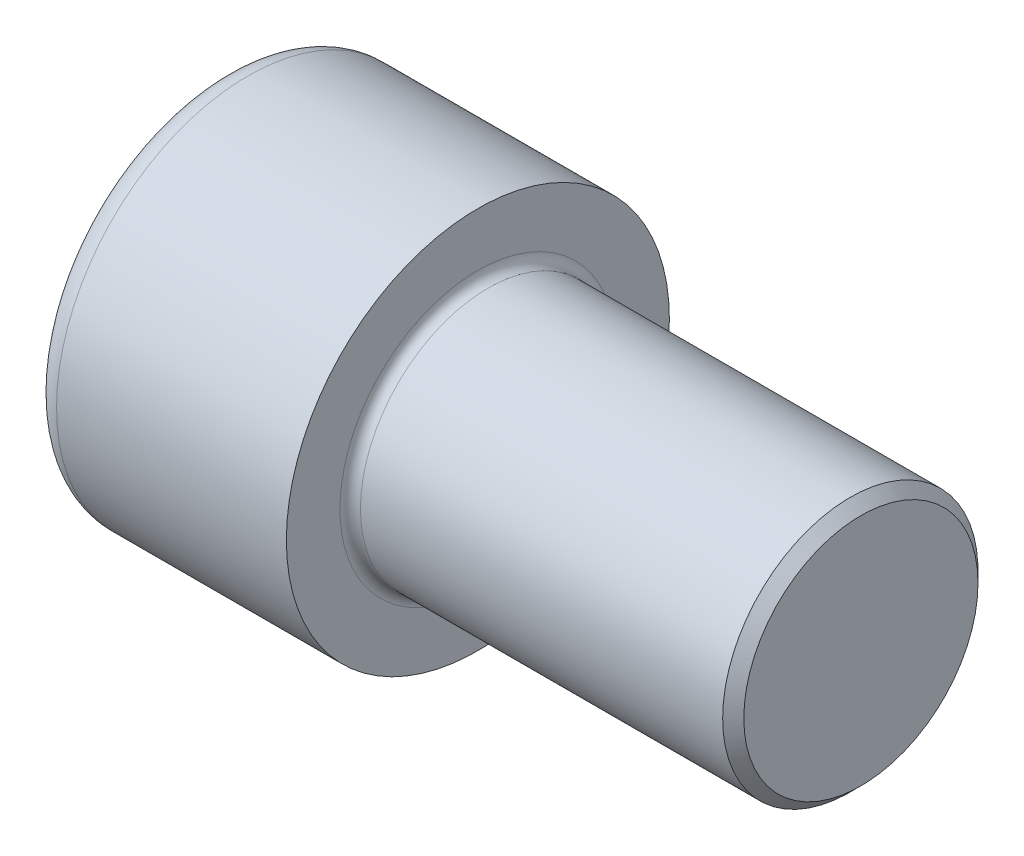
ISO-10303-21;
HEADER;
FILE_DESCRIPTION(('STEP AP214'),'2;1');
FILE_NAME('part.step','',(''),(''),'','','');
FILE_SCHEMA(('AUTOMOTIVE_DESIGN { 1 0 10303 214 1 1 1 1 }'));
ENDSEC;
DATA;
#1=APPLICATION_CONTEXT('core data for automotive mechanical design processes');
#2=APPLICATION_PROTOCOL_DEFINITION('international standard','automotive_design',2000,#1);
#3=PRODUCT_CONTEXT('',#1,'mechanical');
#4=PRODUCT('Part','Part','',(#3));
#5=PRODUCT_RELATED_PRODUCT_CATEGORY('part','',(#4));
#6=PRODUCT_DEFINITION_FORMATION('','',#4);
#7=PRODUCT_DEFINITION_CONTEXT('part definition',#1,'design');
#8=PRODUCT_DEFINITION('design','',#6,#7);
#9=PRODUCT_DEFINITION_SHAPE('','',#8);
#10=(LENGTH_UNIT() NAMED_UNIT(*) SI_UNIT(.MILLI.,.METRE.));
#11=(NAMED_UNIT(*) PLANE_ANGLE_UNIT() SI_UNIT($,.RADIAN.));
#12=(NAMED_UNIT(*) SI_UNIT($,.STERADIAN.) SOLID_ANGLE_UNIT());
#13=UNCERTAINTY_MEASURE_WITH_UNIT(LENGTH_MEASURE(1.E-05),#10,'distance_accuracy_value','');
#14=(GEOMETRIC_REPRESENTATION_CONTEXT(3) GLOBAL_UNCERTAINTY_ASSIGNED_CONTEXT((#13)) GLOBAL_UNIT_ASSIGNED_CONTEXT((#10,
#11,#12)) REPRESENTATION_CONTEXT('',''));
#15=CARTESIAN_POINT('',(0.,0.,0.));
#16=DIRECTION('',(0.,0.,1.));
#17=DIRECTION('',(1.,0.,0.));
#18=AXIS2_PLACEMENT_3D('',#15,#16,#17);
#19=CARTESIAN_POINT('',(0.,0.,0.));
#20=DIRECTION('',(-1.,0.,0.));
#21=DIRECTION('',(0.,0.,1.));
#22=AXIS2_PLACEMENT_3D('',#19,#20,#21);
#23=PLANE('',#22);
#24=DIRECTION('',(0.,-0.499999999999999,0.866025403784439));
#25=VECTOR('',#24,1.);
#26=CARTESIAN_POINT('',(0.,9.84382208968312,0.));
#27=LINE('',#26,#25);
#28=CARTESIAN_POINT('',(0.,9.84382208968312,0.));
#29=VERTEX_POINT('',#28);
#30=CARTESIAN_POINT('',(0.,4.92191104484157,8.52499999999999));
#31=VERTEX_POINT('',#30);
#32=EDGE_CURVE('E258',#29,#31,#27,.T.);
#33=ORIENTED_EDGE('',*,*,#32,.T.);
#34=DIRECTION('',(0.,1.,0.));
#35=VECTOR('',#34,1.);
#36=CARTESIAN_POINT('',(0.,-4.92191104484155,8.525));
#37=LINE('',#36,#35);
#38=CARTESIAN_POINT('',(0.,-4.92191104484155,8.525));
#39=VERTEX_POINT('',#38);
#40=EDGE_CURVE('E130',#39,#31,#37,.T.);
#41=ORIENTED_EDGE('',*,*,#40,.F.);
#42=DIRECTION('',(0.,-0.500000000000001,-0.866025403784438));
#43=VECTOR('',#42,1.);
#44=CARTESIAN_POINT('',(0.,-4.92191104484155,8.525));
#45=LINE('',#44,#43);
#46=CARTESIAN_POINT('',(0.,-9.84382208968312,0.));
#47=VERTEX_POINT('',#46);
#48=EDGE_CURVE('E261',#39,#47,#45,.T.);
#49=ORIENTED_EDGE('',*,*,#48,.T.);
#50=DIRECTION('',(0.,0.499999999999999,-0.866025403784439));
#51=VECTOR('',#50,1.);
#52=CARTESIAN_POINT('',(0.,-9.84382208968312,0.));
#53=LINE('',#52,#51);
#54=CARTESIAN_POINT('',(0.,-4.92191104484157,-8.525));
#55=VERTEX_POINT('',#54);
#56=EDGE_CURVE('E264',#47,#55,#53,.T.);
#57=ORIENTED_EDGE('',*,*,#56,.T.);
#58=DIRECTION('',(0.,-1.,0.));
#59=VECTOR('',#58,1.);
#60=CARTESIAN_POINT('',(0.,4.92191104484154,-8.52500000000001));
#61=LINE('',#60,#59);
#62=CARTESIAN_POINT('',(0.,4.92191104484154,-8.52500000000001));
#63=VERTEX_POINT('',#62);
#64=EDGE_CURVE('E267',#63,#55,#61,.T.);
#65=ORIENTED_EDGE('',*,*,#64,.F.);
#66=DIRECTION('',(0.,-0.500000000000001,-0.866025403784438));
#67=VECTOR('',#66,1.);
#68=CARTESIAN_POINT('',(0.,9.84382208968312,0.));
#69=LINE('',#68,#67);
#70=EDGE_CURVE('E125',#29,#63,#69,.T.);
#71=ORIENTED_EDGE('',*,*,#70,.F.);
#72=EDGE_LOOP('',(#33,#41,#49,#57,#65,#71));
#73=FACE_BOUND('',#72,.T.);
#74=CARTESIAN_POINT('',(0.,0.,0.));
#75=DIRECTION('',(-1.,0.,0.));
#76=DIRECTION('',(0.,0.,1.));
#77=AXIS2_PLACEMENT_3D('',#74,#75,#76);
#78=CIRCLE('',#77,13.);
#79=CARTESIAN_POINT('',(0.,0.,13.));
#80=VERTEX_POINT('',#79);
#81=EDGE_CURVE('E42',#80,#80,#78,.T.);
#82=ORIENTED_EDGE('',*,*,#81,.T.);
#83=EDGE_LOOP('',(#82));
#84=FACE_BOUND('',#83,.T.);
#85=ADVANCED_FACE('F34',(#73,#84),#23,.T.);
#86=CARTESIAN_POINT('',(-31.75,0.,0.));
#87=DIRECTION('',(-1.,0.,0.));
#88=DIRECTION('',(0.,0.,1.));
#89=AXIS2_PLACEMENT_3D('',#86,#87,#88);
#90=CYLINDRICAL_SURFACE('',#89,15.);
#91=CARTESIAN_POINT('',(2.,0.,0.));
#92=DIRECTION('',(-1.,0.,0.));
#93=DIRECTION('',(0.,0.,1.));
#94=AXIS2_PLACEMENT_3D('',#91,#92,#93);
#95=CIRCLE('',#94,15.);
#96=CARTESIAN_POINT('',(2.,0.,15.));
#97=VERTEX_POINT('',#96);
#98=EDGE_CURVE('E11',#97,#97,#95,.F.);
#99=ORIENTED_EDGE('',*,*,#98,.T.);
#100=EDGE_LOOP('',(#99));
#101=FACE_BOUND('',#100,.T.);
#102=CARTESIAN_POINT('',(20.,0.,0.));
#103=DIRECTION('',(-1.,0.,0.));
#104=DIRECTION('',(0.,0.,1.));
#105=AXIS2_PLACEMENT_3D('',#102,#103,#104);
#106=CIRCLE('',#105,15.);
#107=CARTESIAN_POINT('',(20.,0.,15.));
#108=VERTEX_POINT('',#107);
#109=EDGE_CURVE('E148',#108,#108,#106,.T.);
#110=ORIENTED_EDGE('',*,*,#109,.T.);
#111=EDGE_LOOP('',(#110));
#112=FACE_BOUND('',#111,.T.);
#113=ADVANCED_FACE('F172',(#101,#112),#90,.T.);
#114=CARTESIAN_POINT('',(20.,15.,0.));
#115=DIRECTION('',(1.,0.,0.));
#116=DIRECTION('',(0.,0.,-1.));
#117=AXIS2_PLACEMENT_3D('',#114,#115,#116);
#118=PLANE('',#117);
#119=CARTESIAN_POINT('',(20.,0.,0.));
#120=DIRECTION('',(1.,0.,0.));
#121=DIRECTION('',(0.,0.,-1.));
#122=AXIS2_PLACEMENT_3D('',#119,#120,#121);
#123=CIRCLE('',#122,10.8);
#124=CARTESIAN_POINT('',(20.,0.,-10.8));
#125=VERTEX_POINT('',#124);
#126=EDGE_CURVE('E151',#125,#125,#123,.F.);
#127=ORIENTED_EDGE('',*,*,#126,.T.);
#128=EDGE_LOOP('',(#127));
#129=FACE_BOUND('',#128,.T.);
#130=ORIENTED_EDGE('',*,*,#109,.F.);
#131=EDGE_LOOP('',(#130));
#132=FACE_BOUND('',#131,.T.);
#133=ADVANCED_FACE('F178',(#129,#132),#118,.T.);
#134=CARTESIAN_POINT('',(-31.75,0.,0.));
#135=DIRECTION('',(-1.,0.,0.));
#136=DIRECTION('',(0.,0.,1.));
#137=AXIS2_PLACEMENT_3D('',#134,#135,#136);
#138=CYLINDRICAL_SURFACE('',#137,10.);
#139=CARTESIAN_POINT('',(20.8,0.,0.));
#140=DIRECTION('',(1.,0.,0.));
#141=DIRECTION('',(0.,0.,-1.));
#142=AXIS2_PLACEMENT_3D('',#139,#140,#141);
#143=CIRCLE('',#142,10.);
#144=CARTESIAN_POINT('',(20.8,0.,-10.));
#145=VERTEX_POINT('',#144);
#146=EDGE_CURVE('E154',#145,#145,#143,.T.);
#147=ORIENTED_EDGE('',*,*,#146,.T.);
#148=EDGE_LOOP('',(#147));
#149=FACE_BOUND('',#148,.T.);
#150=CARTESIAN_POINT('',(49.172,0.,0.));
#151=DIRECTION('',(-1.,0.,0.));
#152=DIRECTION('',(0.,0.,1.));
#153=AXIS2_PLACEMENT_3D('',#150,#151,#152);
#154=CIRCLE('',#153,10.);
#155=CARTESIAN_POINT('',(49.172,0.,10.));
#156=VERTEX_POINT('',#155);
#157=EDGE_CURVE('E145',#156,#156,#154,.T.);
#158=ORIENTED_EDGE('',*,*,#157,.T.);
#159=EDGE_LOOP('',(#158));
#160=FACE_BOUND('',#159,.T.);
#161=ADVANCED_FACE('F184',(#149,#160),#138,.T.);
#162=CARTESIAN_POINT('',(50.,0.,0.));
#163=DIRECTION('',(-1.,0.,0.));
#164=DIRECTION('',(0.,0.,1.));
#165=AXIS2_PLACEMENT_3D('',#162,#163,#164);
#166=CONICAL_SURFACE('',#165,9.172,0.78539816339745);
#167=ORIENTED_EDGE('',*,*,#157,.F.);
#168=EDGE_LOOP('',(#167));
#169=FACE_BOUND('',#168,.T.);
#170=CARTESIAN_POINT('',(50.,0.,0.));
#171=DIRECTION('',(-1.,0.,0.));
#172=DIRECTION('',(0.,0.,1.));
#173=AXIS2_PLACEMENT_3D('',#170,#171,#172);
#174=CIRCLE('',#173,9.172);
#175=CARTESIAN_POINT('',(50.,0.,9.172));
#176=VERTEX_POINT('',#175);
#177=EDGE_CURVE('E141',#176,#176,#174,.T.);
#178=ORIENTED_EDGE('',*,*,#177,.T.);
#179=EDGE_LOOP('',(#178));
#180=FACE_BOUND('',#179,.T.);
#181=ADVANCED_FACE('F188',(#169,#180),#166,.T.);
#182=CARTESIAN_POINT('',(50.,9.172,0.));
#183=DIRECTION('',(1.,0.,0.));
#184=DIRECTION('',(0.,0.,-1.));
#185=AXIS2_PLACEMENT_3D('',#182,#183,#184);
#186=PLANE('',#185);
#187=ORIENTED_EDGE('',*,*,#177,.F.);
#188=EDGE_LOOP('',(#187));
#189=FACE_BOUND('',#188,.T.);
#190=ADVANCED_FACE('F168',(#189),#186,.T.);
#191=CARTESIAN_POINT('',(20.8,0.,0.));
#192=DIRECTION('',(1.,0.,0.));
#193=DIRECTION('',(0.,0.,-1.));
#194=AXIS2_PLACEMENT_3D('',#191,#192,#193);
#195=TOROIDAL_SURFACE('',#194,10.8,0.8);
#196=ORIENTED_EDGE('',*,*,#146,.F.);
#197=EDGE_LOOP('',(#196));
#198=FACE_BOUND('',#197,.T.);
#199=ORIENTED_EDGE('',*,*,#126,.F.);
#200=EDGE_LOOP('',(#199));
#201=FACE_BOUND('',#200,.T.);
#202=ADVANCED_FACE('F161',(#198,#201),#195,.F.);
#203=CARTESIAN_POINT('',(2.,0.,0.));
#204=DIRECTION('',(-1.,0.,0.));
#205=DIRECTION('',(0.,0.,1.));
#206=AXIS2_PLACEMENT_3D('',#203,#204,#205);
#207=TOROIDAL_SURFACE('',#206,13.,2.);
#208=ORIENTED_EDGE('',*,*,#98,.F.);
#209=EDGE_LOOP('',(#208));
#210=FACE_BOUND('',#209,.T.);
#211=ORIENTED_EDGE('',*,*,#81,.F.);
#212=EDGE_LOOP('',(#211));
#213=FACE_BOUND('',#212,.T.);
#214=ADVANCED_FACE('F36',(#210,#213),#207,.T.);
#215=CARTESIAN_POINT('',(10.,9.84382208968312,0.));
#216=DIRECTION('',(0.,-0.866025403784439,-0.499999999999999));
#217=DIRECTION('',(0.,0.499999999999999,-0.866025403784439));
#218=AXIS2_PLACEMENT_3D('',#215,#216,#217);
#219=PLANE('',#218);
#220=ORIENTED_EDGE('',*,*,#32,.F.);
#221=DIRECTION('',(-1.,0.,0.));
#222=VECTOR('',#221,1.);
#223=CARTESIAN_POINT('',(10.,9.84382208968312,0.));
#224=LINE('',#223,#222);
#225=CARTESIAN_POINT('',(10.,9.84382208968312,0.));
#226=VERTEX_POINT('',#225);
#227=EDGE_CURVE('E248',#226,#29,#224,.T.);
#228=ORIENTED_EDGE('',*,*,#227,.F.);
#229=DIRECTION('',(0.,-0.499999999999999,0.866025403784439));
#230=VECTOR('',#229,1.);
#231=CARTESIAN_POINT('',(10.,9.84382208968312,0.));
#232=LINE('',#231,#230);
#233=CARTESIAN_POINT('',(10.,7.38286656726234,4.26249999999999));
#234=VERTEX_POINT('',#233);
#235=EDGE_CURVE('E117',#226,#234,#232,.T.);
#236=ORIENTED_EDGE('',*,*,#235,.T.);
#237=CARTESIAN_POINT('',(10.,4.92191104484157,8.52499999999999));
#238=VERTEX_POINT('',#237);
#239=EDGE_CURVE('E108',#234,#238,#232,.T.);
#240=ORIENTED_EDGE('',*,*,#239,.T.);
#241=DIRECTION('',(-1.,0.,0.));
#242=VECTOR('',#241,1.);
#243=CARTESIAN_POINT('',(10.,4.92191104484157,8.52499999999999));
#244=LINE('',#243,#242);
#245=EDGE_CURVE('E122',#238,#31,#244,.T.);
#246=ORIENTED_EDGE('',*,*,#245,.T.);
#247=EDGE_LOOP('',(#220,#228,#236,#240,#246));
#248=FACE_BOUND('',#247,.T.);
#249=ADVANCED_FACE('F121',(#248),#219,.T.);
#250=CARTESIAN_POINT('',(10.,-4.92191104484155,8.525));
#251=DIRECTION('',(0.,0.,1.));
#252=DIRECTION('',(0.,-1.,0.));
#253=AXIS2_PLACEMENT_3D('',#250,#251,#252);
#254=PLANE('',#253);
#255=ORIENTED_EDGE('',*,*,#40,.T.);
#256=ORIENTED_EDGE('',*,*,#245,.F.);
#257=DIRECTION('',(0.,1.,0.));
#258=VECTOR('',#257,1.);
#259=CARTESIAN_POINT('',(10.,-4.92191104484155,8.525));
#260=LINE('',#259,#258);
#261=CARTESIAN_POINT('',(10.,0.,8.525));
#262=VERTEX_POINT('',#261);
#263=EDGE_CURVE('E105',#262,#238,#260,.T.);
#264=ORIENTED_EDGE('',*,*,#263,.F.);
#265=CARTESIAN_POINT('',(10.,-4.92191104484155,8.525));
#266=VERTEX_POINT('',#265);
#267=EDGE_CURVE('E116',#266,#262,#260,.T.);
#268=ORIENTED_EDGE('',*,*,#267,.F.);
#269=DIRECTION('',(-1.,0.,0.));
#270=VECTOR('',#269,1.);
#271=CARTESIAN_POINT('',(10.,-4.92191104484155,8.525));
#272=LINE('',#271,#270);
#273=EDGE_CURVE('E132',#266,#39,#272,.T.);
#274=ORIENTED_EDGE('',*,*,#273,.T.);
#275=EDGE_LOOP('',(#255,#256,#264,#268,#274));
#276=FACE_BOUND('',#275,.T.);
#277=ADVANCED_FACE('F127',(#276),#254,.F.);
#278=CARTESIAN_POINT('',(10.,-4.92191104484155,8.525));
#279=DIRECTION('',(0.,0.866025403784438,-0.500000000000001));
#280=DIRECTION('',(0.,0.500000000000001,0.866025403784438));
#281=AXIS2_PLACEMENT_3D('',#278,#279,#280);
#282=PLANE('',#281);
#283=ORIENTED_EDGE('',*,*,#48,.F.);
#284=ORIENTED_EDGE('',*,*,#273,.F.);
#285=DIRECTION('',(0.,-0.500000000000001,-0.866025403784438));
#286=VECTOR('',#285,1.);
#287=CARTESIAN_POINT('',(10.,-4.92191104484155,8.525));
#288=LINE('',#287,#286);
#289=CARTESIAN_POINT('',(10.,-7.38286656726234,4.26250000000001));
#290=VERTEX_POINT('',#289);
#291=EDGE_CURVE('E287',#266,#290,#288,.T.);
#292=ORIENTED_EDGE('',*,*,#291,.T.);
#293=CARTESIAN_POINT('',(10.,-9.84382208968312,0.));
#294=VERTEX_POINT('',#293);
#295=EDGE_CURVE('E276',#290,#294,#288,.T.);
#296=ORIENTED_EDGE('',*,*,#295,.T.);
#297=DIRECTION('',(-1.,0.,0.));
#298=VECTOR('',#297,1.);
#299=CARTESIAN_POINT('',(10.,-9.84382208968312,0.));
#300=LINE('',#299,#298);
#301=EDGE_CURVE('E137',#294,#47,#300,.T.);
#302=ORIENTED_EDGE('',*,*,#301,.T.);
#303=EDGE_LOOP('',(#283,#284,#292,#296,#302));
#304=FACE_BOUND('',#303,.T.);
#305=ADVANCED_FACE('F202',(#304),#282,.T.);
#306=CARTESIAN_POINT('',(10.,-9.84382208968312,0.));
#307=DIRECTION('',(0.,0.866025403784439,0.499999999999999));
#308=DIRECTION('',(0.,-0.499999999999999,0.866025403784439));
#309=AXIS2_PLACEMENT_3D('',#306,#307,#308);
#310=PLANE('',#309);
#311=ORIENTED_EDGE('',*,*,#56,.F.);
#312=ORIENTED_EDGE('',*,*,#301,.F.);
#313=DIRECTION('',(0.,0.499999999999999,-0.866025403784439));
#314=VECTOR('',#313,1.);
#315=CARTESIAN_POINT('',(10.,-9.84382208968312,0.));
#316=LINE('',#315,#314);
#317=CARTESIAN_POINT('',(10.,-7.38286656726235,-4.26249999999999));
#318=VERTEX_POINT('',#317);
#319=EDGE_CURVE('E254',#294,#318,#316,.T.);
#320=ORIENTED_EDGE('',*,*,#319,.T.);
#321=CARTESIAN_POINT('',(10.,-4.92191104484157,-8.525));
#322=VERTEX_POINT('',#321);
#323=EDGE_CURVE('E286',#318,#322,#316,.T.);
#324=ORIENTED_EDGE('',*,*,#323,.T.);
#325=DIRECTION('',(-1.,0.,0.));
#326=VECTOR('',#325,1.);
#327=CARTESIAN_POINT('',(10.,-4.92191104484157,-8.525));
#328=LINE('',#327,#326);
#329=EDGE_CURVE('E247',#322,#55,#328,.T.);
#330=ORIENTED_EDGE('',*,*,#329,.T.);
#331=EDGE_LOOP('',(#311,#312,#320,#324,#330));
#332=FACE_BOUND('',#331,.T.);
#333=ADVANCED_FACE('F205',(#332),#310,.T.);
#334=CARTESIAN_POINT('',(10.,4.92191104484154,-8.52500000000001));
#335=DIRECTION('',(0.,0.,-1.));
#336=DIRECTION('',(0.,1.,0.));
#337=AXIS2_PLACEMENT_3D('',#334,#335,#336);
#338=PLANE('',#337);
#339=ORIENTED_EDGE('',*,*,#64,.T.);
#340=ORIENTED_EDGE('',*,*,#329,.F.);
#341=DIRECTION('',(0.,-1.,0.));
#342=VECTOR('',#341,1.);
#343=CARTESIAN_POINT('',(10.,4.92191104484154,-8.52500000000001));
#344=LINE('',#343,#342);
#345=CARTESIAN_POINT('',(10.,0.,-8.525));
#346=VERTEX_POINT('',#345);
#347=EDGE_CURVE('E251',#346,#322,#344,.T.);
#348=ORIENTED_EDGE('',*,*,#347,.F.);
#349=CARTESIAN_POINT('',(10.,4.92191104484154,-8.52500000000001));
#350=VERTEX_POINT('',#349);
#351=EDGE_CURVE('E49',#350,#346,#344,.T.);
#352=ORIENTED_EDGE('',*,*,#351,.F.);
#353=DIRECTION('',(-1.,0.,0.));
#354=VECTOR('',#353,1.);
#355=CARTESIAN_POINT('',(10.,4.92191104484154,-8.52500000000001));
#356=LINE('',#355,#354);
#357=EDGE_CURVE('E244',#350,#63,#356,.T.);
#358=ORIENTED_EDGE('',*,*,#357,.T.);
#359=EDGE_LOOP('',(#339,#340,#348,#352,#358));
#360=FACE_BOUND('',#359,.T.);
#361=ADVANCED_FACE('F209',(#360),#338,.F.);
#362=CARTESIAN_POINT('',(10.,9.84382208968312,0.));
#363=DIRECTION('',(0.,0.866025403784438,-0.500000000000001));
#364=DIRECTION('',(0.,0.500000000000001,0.866025403784438));
#365=AXIS2_PLACEMENT_3D('',#362,#363,#364);
#366=PLANE('',#365);
#367=ORIENTED_EDGE('',*,*,#70,.T.);
#368=ORIENTED_EDGE('',*,*,#357,.F.);
#369=DIRECTION('',(0.,-0.500000000000001,-0.866025403784438));
#370=VECTOR('',#369,1.);
#371=CARTESIAN_POINT('',(10.,9.84382208968312,0.));
#372=LINE('',#371,#370);
#373=CARTESIAN_POINT('',(10.,7.38286656726233,-4.26250000000001));
#374=VERTEX_POINT('',#373);
#375=EDGE_CURVE('E234',#374,#350,#372,.T.);
#376=ORIENTED_EDGE('',*,*,#375,.F.);
#377=EDGE_CURVE('E240',#226,#374,#372,.T.);
#378=ORIENTED_EDGE('',*,*,#377,.F.);
#379=ORIENTED_EDGE('',*,*,#227,.T.);
#380=EDGE_LOOP('',(#367,#368,#376,#378,#379));
#381=FACE_BOUND('',#380,.T.);
#382=ADVANCED_FACE('F213',(#381),#366,.F.);
#383=CARTESIAN_POINT('',(10.,9.84382208968312,0.));
#384=DIRECTION('',(1.,0.,0.));
#385=DIRECTION('',(0.,0.,-1.));
#386=AXIS2_PLACEMENT_3D('',#383,#384,#385);
#387=PLANE('',#386);
#388=ORIENTED_EDGE('',*,*,#347,.T.);
#389=ORIENTED_EDGE('',*,*,#323,.F.);
#390=CARTESIAN_POINT('',(10.,0.,0.));
#391=DIRECTION('',(-1.,0.,0.));
#392=DIRECTION('',(0.,0.,1.));
#393=AXIS2_PLACEMENT_3D('',#390,#391,#392);
#394=CIRCLE('',#393,8.525);
#395=EDGE_CURVE('E282',#346,#318,#394,.T.);
#396=ORIENTED_EDGE('',*,*,#395,.F.);
#397=EDGE_LOOP('',(#388,#389,#396));
#398=FACE_BOUND('',#397,.T.);
#399=ADVANCED_FACE('F217',(#398),#387,.F.);
#400=ORIENTED_EDGE('',*,*,#319,.F.);
#401=ORIENTED_EDGE('',*,*,#295,.F.);
#402=EDGE_CURVE('E135',#318,#290,#394,.T.);
#403=ORIENTED_EDGE('',*,*,#402,.F.);
#404=EDGE_LOOP('',(#400,#401,#403));
#405=FACE_BOUND('',#404,.T.);
#406=ADVANCED_FACE('F220',(#405),#387,.F.);
#407=ORIENTED_EDGE('',*,*,#291,.F.);
#408=ORIENTED_EDGE('',*,*,#267,.T.);
#409=EDGE_CURVE('E131',#290,#262,#394,.T.);
#410=ORIENTED_EDGE('',*,*,#409,.F.);
#411=EDGE_LOOP('',(#407,#408,#410));
#412=FACE_BOUND('',#411,.T.);
#413=ADVANCED_FACE('F225',(#412),#387,.F.);
#414=ORIENTED_EDGE('',*,*,#263,.T.);
#415=ORIENTED_EDGE('',*,*,#239,.F.);
#416=EDGE_CURVE('E111',#262,#234,#394,.T.);
#417=ORIENTED_EDGE('',*,*,#416,.F.);
#418=EDGE_LOOP('',(#414,#415,#417));
#419=FACE_BOUND('',#418,.T.);
#420=ADVANCED_FACE('F107',(#419),#387,.F.);
#421=ORIENTED_EDGE('',*,*,#235,.F.);
#422=ORIENTED_EDGE('',*,*,#377,.T.);
#423=EDGE_CURVE('E142',#234,#374,#394,.T.);
#424=ORIENTED_EDGE('',*,*,#423,.F.);
#425=EDGE_LOOP('',(#421,#422,#424));
#426=FACE_BOUND('',#425,.T.);
#427=ADVANCED_FACE('F228',(#426),#387,.F.);
#428=ORIENTED_EDGE('',*,*,#375,.T.);
#429=ORIENTED_EDGE('',*,*,#351,.T.);
#430=EDGE_CURVE('E237',#374,#346,#394,.T.);
#431=ORIENTED_EDGE('',*,*,#430,.F.);
#432=EDGE_LOOP('',(#428,#429,#431));
#433=FACE_BOUND('',#432,.T.);
#434=ADVANCED_FACE('F198',(#433),#387,.F.);
#435=CARTESIAN_POINT('',(10.,0.,0.));
#436=DIRECTION('',(-1.,0.,0.));
#437=DIRECTION('',(0.,0.,1.));
#438=AXIS2_PLACEMENT_3D('',#435,#436,#437);
#439=CONICAL_SURFACE('',#438,8.525,1.04719755119659);
#440=CARTESIAN_POINT('',(14.9219110448416,0.,0.));
#441=VERTEX_POINT('',#440);
#442=VERTEX_LOOP('',#441);
#443=FACE_BOUND('',#442,.T.);
#444=ORIENTED_EDGE('',*,*,#416,.T.);
#445=ORIENTED_EDGE('',*,*,#423,.T.);
#446=ORIENTED_EDGE('',*,*,#430,.T.);
#447=ORIENTED_EDGE('',*,*,#395,.T.);
#448=ORIENTED_EDGE('',*,*,#402,.T.);
#449=ORIENTED_EDGE('',*,*,#409,.T.);
#450=EDGE_LOOP('',(#444,#445,#446,#447,#448,#449));
#451=FACE_BOUND('',#450,.T.);
#452=ADVANCED_FACE('F196',(#443,#451),#439,.F.);
#453=CLOSED_SHELL('',(#85,#113,#133,#161,#181,#190,#202,#214,#249,#277,#305,#333,#361,#382,#399,
#406,#413,#420,#427,#434,#452));
#454=MANIFOLD_SOLID_BREP('B2',#453);
#455=ADVANCED_BREP_SHAPE_REPRESENTATION('',(#18,#454),#14);
#456=SHAPE_DEFINITION_REPRESENTATION(#9,#455);
ENDSEC;
END-ISO-10303-21;
